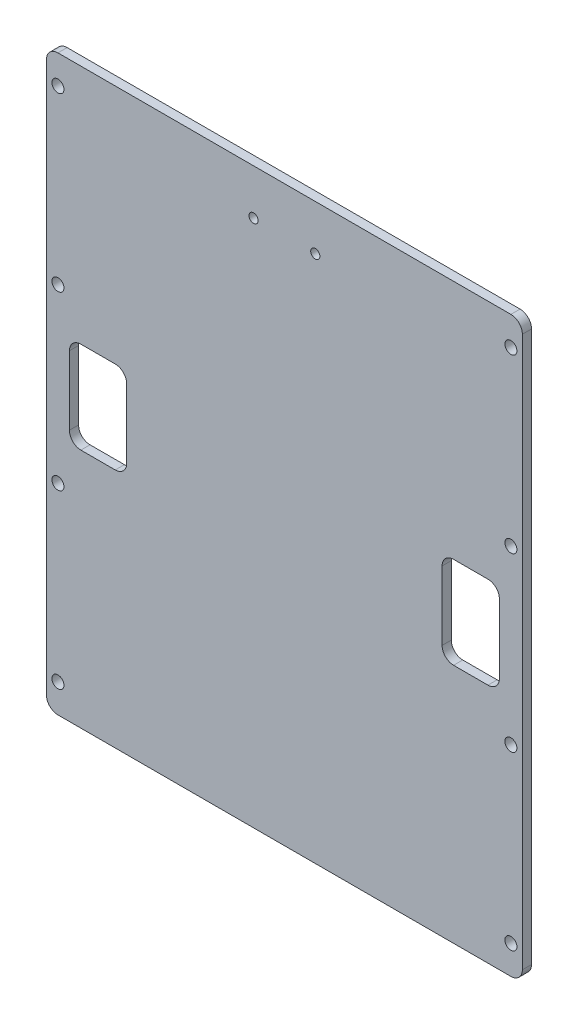
ISO-10303-21;
HEADER;
FILE_DESCRIPTION(('STEP AP214'),'2;1');
FILE_NAME('part.step','',(''),(''),'','','');
FILE_SCHEMA(('AUTOMOTIVE_DESIGN { 1 0 10303 214 1 1 1 1 }'));
ENDSEC;
DATA;
#1=APPLICATION_CONTEXT('core data for automotive mechanical design processes');
#2=APPLICATION_PROTOCOL_DEFINITION('international standard','automotive_design',2000,#1);
#3=PRODUCT_CONTEXT('',#1,'mechanical');
#4=PRODUCT('Part','Part','',(#3));
#5=PRODUCT_RELATED_PRODUCT_CATEGORY('part','',(#4));
#6=PRODUCT_DEFINITION_FORMATION('','',#4);
#7=PRODUCT_DEFINITION_CONTEXT('part definition',#1,'design');
#8=PRODUCT_DEFINITION('design','',#6,#7);
#9=PRODUCT_DEFINITION_SHAPE('','',#8);
#10=(LENGTH_UNIT() NAMED_UNIT(*) SI_UNIT(.MILLI.,.METRE.));
#11=(NAMED_UNIT(*) PLANE_ANGLE_UNIT() SI_UNIT($,.RADIAN.));
#12=(NAMED_UNIT(*) SI_UNIT($,.STERADIAN.) SOLID_ANGLE_UNIT());
#13=UNCERTAINTY_MEASURE_WITH_UNIT(LENGTH_MEASURE(1.E-05),#10,'distance_accuracy_value','');
#14=(GEOMETRIC_REPRESENTATION_CONTEXT(3) GLOBAL_UNCERTAINTY_ASSIGNED_CONTEXT((#13)) GLOBAL_UNIT_ASSIGNED_CONTEXT((#10,
#11,#12)) REPRESENTATION_CONTEXT('',''));
#15=CARTESIAN_POINT('',(0.,0.,0.));
#16=DIRECTION('',(0.,0.,1.));
#17=DIRECTION('',(1.,0.,0.));
#18=AXIS2_PLACEMENT_3D('',#15,#16,#17);
#19=CARTESIAN_POINT('',(-39.5,-48.,1.6));
#20=DIRECTION('',(0.,0.,-1.));
#21=DIRECTION('',(-1.,0.,0.));
#22=AXIS2_PLACEMENT_3D('',#19,#20,#21);
#23=CYLINDRICAL_SURFACE('',#22,2.);
#24=CARTESIAN_POINT('',(-39.5,-48.,0.));
#25=DIRECTION('',(0.,0.,1.));
#26=DIRECTION('',(-1.,0.,0.));
#27=AXIS2_PLACEMENT_3D('',#24,#25,#26);
#28=CIRCLE('',#27,2.);
#29=CARTESIAN_POINT('',(-41.5,-48.,0.));
#30=VERTEX_POINT('',#29);
#31=CARTESIAN_POINT('',(-39.5,-50.,0.));
#32=VERTEX_POINT('',#31);
#33=EDGE_CURVE('E340',#30,#32,#28,.T.);
#34=ORIENTED_EDGE('',*,*,#33,.T.);
#35=DIRECTION('',(0.,0.,-1.));
#36=VECTOR('',#35,1.);
#37=CARTESIAN_POINT('',(-39.5,-50.,1.6));
#38=LINE('',#37,#36);
#39=CARTESIAN_POINT('',(-39.5,-50.,1.6));
#40=VERTEX_POINT('',#39);
#41=EDGE_CURVE('E11',#40,#32,#38,.T.);
#42=ORIENTED_EDGE('',*,*,#41,.F.);
#43=CARTESIAN_POINT('',(-39.5,-48.,1.6));
#44=DIRECTION('',(0.,0.,1.));
#45=DIRECTION('',(-1.,0.,0.));
#46=AXIS2_PLACEMENT_3D('',#43,#44,#45);
#47=CIRCLE('',#46,2.);
#48=CARTESIAN_POINT('',(-41.5,-48.,1.6));
#49=VERTEX_POINT('',#48);
#50=EDGE_CURVE('E343',#49,#40,#47,.T.);
#51=ORIENTED_EDGE('',*,*,#50,.F.);
#52=DIRECTION('',(0.,0.,-1.));
#53=VECTOR('',#52,1.);
#54=CARTESIAN_POINT('',(-41.5,-48.,1.6));
#55=LINE('',#54,#53);
#56=EDGE_CURVE('E361',#49,#30,#55,.T.);
#57=ORIENTED_EDGE('',*,*,#56,.T.);
#58=EDGE_LOOP('',(#34,#42,#51,#57));
#59=FACE_BOUND('',#58,.T.);
#60=ADVANCED_FACE('F35',(#59),#23,.T.);
#61=CARTESIAN_POINT('',(-39.5,-50.,1.6));
#62=DIRECTION('',(0.,1.,0.));
#63=DIRECTION('',(0.,0.,1.));
#64=AXIS2_PLACEMENT_3D('',#61,#62,#63);
#65=PLANE('',#64);
#66=DIRECTION('',(1.,0.,0.));
#67=VECTOR('',#66,1.);
#68=CARTESIAN_POINT('',(-39.5,-50.,0.));
#69=LINE('',#68,#67);
#70=CARTESIAN_POINT('',(39.5,-50.,0.));
#71=VERTEX_POINT('',#70);
#72=EDGE_CURVE('E364',#32,#71,#69,.T.);
#73=ORIENTED_EDGE('',*,*,#72,.T.);
#74=DIRECTION('',(0.,0.,-1.));
#75=VECTOR('',#74,1.);
#76=CARTESIAN_POINT('',(39.5,-50.,1.6));
#77=LINE('',#76,#75);
#78=CARTESIAN_POINT('',(39.5,-50.,1.6));
#79=VERTEX_POINT('',#78);
#80=EDGE_CURVE('E42',#79,#71,#77,.T.);
#81=ORIENTED_EDGE('',*,*,#80,.F.);
#82=DIRECTION('',(1.,0.,0.));
#83=VECTOR('',#82,1.);
#84=CARTESIAN_POINT('',(-39.5,-50.,1.6));
#85=LINE('',#84,#83);
#86=EDGE_CURVE('E346',#40,#79,#85,.T.);
#87=ORIENTED_EDGE('',*,*,#86,.F.);
#88=ORIENTED_EDGE('',*,*,#41,.T.);
#89=EDGE_LOOP('',(#73,#81,#87,#88));
#90=FACE_BOUND('',#89,.T.);
#91=ADVANCED_FACE('F420',(#90),#65,.F.);
#92=CARTESIAN_POINT('',(39.5,-48.,1.6));
#93=DIRECTION('',(0.,0.,-1.));
#94=DIRECTION('',(-1.,0.,0.));
#95=AXIS2_PLACEMENT_3D('',#92,#93,#94);
#96=CYLINDRICAL_SURFACE('',#95,2.);
#97=CARTESIAN_POINT('',(39.5,-48.,0.));
#98=DIRECTION('',(0.,0.,1.));
#99=DIRECTION('',(1.,0.,0.));
#100=AXIS2_PLACEMENT_3D('',#97,#98,#99);
#101=CIRCLE('',#100,2.);
#102=CARTESIAN_POINT('',(41.5,-48.,0.));
#103=VERTEX_POINT('',#102);
#104=EDGE_CURVE('E366',#71,#103,#101,.T.);
#105=ORIENTED_EDGE('',*,*,#104,.T.);
#106=DIRECTION('',(0.,0.,-1.));
#107=VECTOR('',#106,1.);
#108=CARTESIAN_POINT('',(41.5,-48.,1.6));
#109=LINE('',#108,#107);
#110=CARTESIAN_POINT('',(41.5,-48.,1.6));
#111=VERTEX_POINT('',#110);
#112=EDGE_CURVE('E391',#111,#103,#109,.T.);
#113=ORIENTED_EDGE('',*,*,#112,.F.);
#114=CARTESIAN_POINT('',(39.5,-48.,1.6));
#115=DIRECTION('',(0.,0.,1.));
#116=DIRECTION('',(1.,0.,0.));
#117=AXIS2_PLACEMENT_3D('',#114,#115,#116);
#118=CIRCLE('',#117,2.);
#119=EDGE_CURVE('E349',#79,#111,#118,.T.);
#120=ORIENTED_EDGE('',*,*,#119,.F.);
#121=ORIENTED_EDGE('',*,*,#80,.T.);
#122=EDGE_LOOP('',(#105,#113,#120,#121));
#123=FACE_BOUND('',#122,.T.);
#124=ADVANCED_FACE('F398',(#123),#96,.T.);
#125=CARTESIAN_POINT('',(41.5,-48.,1.6));
#126=DIRECTION('',(-1.,0.,0.));
#127=DIRECTION('',(0.,0.,1.));
#128=AXIS2_PLACEMENT_3D('',#125,#126,#127);
#129=PLANE('',#128);
#130=DIRECTION('',(0.,1.,0.));
#131=VECTOR('',#130,1.);
#132=CARTESIAN_POINT('',(41.5,-48.,0.));
#133=LINE('',#132,#131);
#134=CARTESIAN_POINT('',(41.5,48.,0.));
#135=VERTEX_POINT('',#134);
#136=EDGE_CURVE('E368',#103,#135,#133,.T.);
#137=ORIENTED_EDGE('',*,*,#136,.T.);
#138=DIRECTION('',(0.,0.,-1.));
#139=VECTOR('',#138,1.);
#140=CARTESIAN_POINT('',(41.5,48.,1.6));
#141=LINE('',#140,#139);
#142=CARTESIAN_POINT('',(41.5,48.,1.6));
#143=VERTEX_POINT('',#142);
#144=EDGE_CURVE('E388',#143,#135,#141,.T.);
#145=ORIENTED_EDGE('',*,*,#144,.F.);
#146=DIRECTION('',(0.,1.,0.));
#147=VECTOR('',#146,1.);
#148=CARTESIAN_POINT('',(41.5,-48.,1.6));
#149=LINE('',#148,#147);
#150=EDGE_CURVE('E351',#111,#143,#149,.T.);
#151=ORIENTED_EDGE('',*,*,#150,.F.);
#152=ORIENTED_EDGE('',*,*,#112,.T.);
#153=EDGE_LOOP('',(#137,#145,#151,#152));
#154=FACE_BOUND('',#153,.T.);
#155=ADVANCED_FACE('F408',(#154),#129,.F.);
#156=CARTESIAN_POINT('',(39.5,48.,1.6));
#157=DIRECTION('',(0.,0.,-1.));
#158=DIRECTION('',(-1.,0.,0.));
#159=AXIS2_PLACEMENT_3D('',#156,#157,#158);
#160=CYLINDRICAL_SURFACE('',#159,2.);
#161=CARTESIAN_POINT('',(39.5,48.,0.));
#162=DIRECTION('',(0.,0.,1.));
#163=DIRECTION('',(-1.,0.,0.));
#164=AXIS2_PLACEMENT_3D('',#161,#162,#163);
#165=CIRCLE('',#164,2.);
#166=CARTESIAN_POINT('',(39.5,50.,0.));
#167=VERTEX_POINT('',#166);
#168=EDGE_CURVE('E370',#135,#167,#165,.T.);
#169=ORIENTED_EDGE('',*,*,#168,.T.);
#170=DIRECTION('',(0.,0.,-1.));
#171=VECTOR('',#170,1.);
#172=CARTESIAN_POINT('',(39.5,50.,1.6));
#173=LINE('',#172,#171);
#174=CARTESIAN_POINT('',(39.5,50.,1.6));
#175=VERTEX_POINT('',#174);
#176=EDGE_CURVE('E385',#175,#167,#173,.T.);
#177=ORIENTED_EDGE('',*,*,#176,.F.);
#178=CARTESIAN_POINT('',(39.5,48.,1.6));
#179=DIRECTION('',(0.,0.,1.));
#180=DIRECTION('',(-1.,0.,0.));
#181=AXIS2_PLACEMENT_3D('',#178,#179,#180);
#182=CIRCLE('',#181,2.);
#183=EDGE_CURVE('E353',#143,#175,#182,.T.);
#184=ORIENTED_EDGE('',*,*,#183,.F.);
#185=ORIENTED_EDGE('',*,*,#144,.T.);
#186=EDGE_LOOP('',(#169,#177,#184,#185));
#187=FACE_BOUND('',#186,.T.);
#188=ADVANCED_FACE('F412',(#187),#160,.T.);
#189=CARTESIAN_POINT('',(-39.5,50.,1.6));
#190=DIRECTION('',(0.,-1.,0.));
#191=DIRECTION('',(0.,0.,-1.));
#192=AXIS2_PLACEMENT_3D('',#189,#190,#191);
#193=PLANE('',#192);
#194=DIRECTION('',(-1.,0.,0.));
#195=VECTOR('',#194,1.);
#196=CARTESIAN_POINT('',(-39.5,50.,0.));
#197=LINE('',#196,#195);
#198=CARTESIAN_POINT('',(-39.5,50.,0.));
#199=VERTEX_POINT('',#198);
#200=EDGE_CURVE('E372',#167,#199,#197,.T.);
#201=ORIENTED_EDGE('',*,*,#200,.T.);
#202=DIRECTION('',(0.,0.,-1.));
#203=VECTOR('',#202,1.);
#204=CARTESIAN_POINT('',(-39.5,50.,1.6));
#205=LINE('',#204,#203);
#206=CARTESIAN_POINT('',(-39.5,50.,1.6));
#207=VERTEX_POINT('',#206);
#208=EDGE_CURVE('E382',#207,#199,#205,.T.);
#209=ORIENTED_EDGE('',*,*,#208,.F.);
#210=DIRECTION('',(-1.,0.,0.));
#211=VECTOR('',#210,1.);
#212=CARTESIAN_POINT('',(-39.5,50.,1.6));
#213=LINE('',#212,#211);
#214=EDGE_CURVE('E355',#175,#207,#213,.T.);
#215=ORIENTED_EDGE('',*,*,#214,.F.);
#216=ORIENTED_EDGE('',*,*,#176,.T.);
#217=EDGE_LOOP('',(#201,#209,#215,#216));
#218=FACE_BOUND('',#217,.T.);
#219=ADVANCED_FACE('F433',(#218),#193,.F.);
#220=CARTESIAN_POINT('',(-39.5,48.,1.6));
#221=DIRECTION('',(0.,0.,-1.));
#222=DIRECTION('',(-1.,0.,0.));
#223=AXIS2_PLACEMENT_3D('',#220,#221,#222);
#224=CYLINDRICAL_SURFACE('',#223,2.);
#225=CARTESIAN_POINT('',(-39.5,48.,0.));
#226=DIRECTION('',(0.,0.,1.));
#227=DIRECTION('',(-1.,0.,0.));
#228=AXIS2_PLACEMENT_3D('',#225,#226,#227);
#229=CIRCLE('',#228,2.);
#230=CARTESIAN_POINT('',(-41.5,48.,0.));
#231=VERTEX_POINT('',#230);
#232=EDGE_CURVE('E374',#199,#231,#229,.T.);
#233=ORIENTED_EDGE('',*,*,#232,.T.);
#234=DIRECTION('',(0.,0.,-1.));
#235=VECTOR('',#234,1.);
#236=CARTESIAN_POINT('',(-41.5,48.,1.6));
#237=LINE('',#236,#235);
#238=CARTESIAN_POINT('',(-41.5,48.,1.6));
#239=VERTEX_POINT('',#238);
#240=EDGE_CURVE('E379',#239,#231,#237,.T.);
#241=ORIENTED_EDGE('',*,*,#240,.F.);
#242=CARTESIAN_POINT('',(-39.5,48.,1.6));
#243=DIRECTION('',(0.,0.,1.));
#244=DIRECTION('',(-1.,0.,0.));
#245=AXIS2_PLACEMENT_3D('',#242,#243,#244);
#246=CIRCLE('',#245,2.);
#247=EDGE_CURVE('E357',#207,#239,#246,.T.);
#248=ORIENTED_EDGE('',*,*,#247,.F.);
#249=ORIENTED_EDGE('',*,*,#208,.T.);
#250=EDGE_LOOP('',(#233,#241,#248,#249));
#251=FACE_BOUND('',#250,.T.);
#252=ADVANCED_FACE('F431',(#251),#224,.T.);
#253=CARTESIAN_POINT('',(-41.5,-48.,1.6));
#254=DIRECTION('',(1.,0.,0.));
#255=DIRECTION('',(0.,0.,-1.));
#256=AXIS2_PLACEMENT_3D('',#253,#254,#255);
#257=PLANE('',#256);
#258=DIRECTION('',(0.,-1.,0.));
#259=VECTOR('',#258,1.);
#260=CARTESIAN_POINT('',(-41.5,-48.,0.));
#261=LINE('',#260,#259);
#262=EDGE_CURVE('E347',#231,#30,#261,.T.);
#263=ORIENTED_EDGE('',*,*,#262,.T.);
#264=ORIENTED_EDGE('',*,*,#56,.F.);
#265=DIRECTION('',(0.,-1.,0.));
#266=VECTOR('',#265,1.);
#267=CARTESIAN_POINT('',(-41.5,-48.,1.6));
#268=LINE('',#267,#266);
#269=EDGE_CURVE('E359',#239,#49,#268,.T.);
#270=ORIENTED_EDGE('',*,*,#269,.F.);
#271=ORIENTED_EDGE('',*,*,#240,.T.);
#272=EDGE_LOOP('',(#263,#264,#270,#271));
#273=FACE_BOUND('',#272,.T.);
#274=ADVANCED_FACE('F426',(#273),#257,.F.);
#275=CARTESIAN_POINT('',(-39.5,-48.,1.6));
#276=DIRECTION('',(0.,0.,-1.));
#277=DIRECTION('',(-1.,0.,0.));
#278=AXIS2_PLACEMENT_3D('',#275,#276,#277);
#279=PLANE('',#278);
#280=CARTESIAN_POINT('',(39.5,45.,1.6));
#281=DIRECTION('',(0.,0.,-1.));
#282=DIRECTION('',(-1.,0.,0.));
#283=AXIS2_PLACEMENT_3D('',#280,#281,#282);
#284=CIRCLE('',#283,1.05);
#285=CARTESIAN_POINT('',(38.45,45.,1.6));
#286=VERTEX_POINT('',#285);
#287=EDGE_CURVE('E760',#286,#286,#284,.T.);
#288=ORIENTED_EDGE('',*,*,#287,.T.);
#289=EDGE_LOOP('',(#288));
#290=FACE_BOUND('',#289,.T.);
#291=CARTESIAN_POINT('',(39.5,-15.,1.6));
#292=DIRECTION('',(0.,0.,-1.));
#293=DIRECTION('',(-1.,0.,0.));
#294=AXIS2_PLACEMENT_3D('',#291,#292,#293);
#295=CIRCLE('',#294,1.05);
#296=CARTESIAN_POINT('',(38.45,-15.,1.6));
#297=VERTEX_POINT('',#296);
#298=EDGE_CURVE('E770',#297,#297,#295,.T.);
#299=ORIENTED_EDGE('',*,*,#298,.T.);
#300=EDGE_LOOP('',(#299));
#301=FACE_BOUND('',#300,.T.);
#302=CARTESIAN_POINT('',(39.5,-45.,1.6));
#303=DIRECTION('',(0.,0.,-1.));
#304=DIRECTION('',(-1.,0.,0.));
#305=AXIS2_PLACEMENT_3D('',#302,#303,#304);
#306=CIRCLE('',#305,1.05);
#307=CARTESIAN_POINT('',(38.45,-45.,1.6));
#308=VERTEX_POINT('',#307);
#309=EDGE_CURVE('E776',#308,#308,#306,.T.);
#310=ORIENTED_EDGE('',*,*,#309,.T.);
#311=EDGE_LOOP('',(#310));
#312=FACE_BOUND('',#311,.T.);
#313=CARTESIAN_POINT('',(39.5,15.,1.6));
#314=DIRECTION('',(0.,0.,-1.));
#315=DIRECTION('',(-1.,0.,0.));
#316=AXIS2_PLACEMENT_3D('',#313,#314,#315);
#317=CIRCLE('',#316,1.05);
#318=CARTESIAN_POINT('',(38.45,15.,1.6));
#319=VERTEX_POINT('',#318);
#320=EDGE_CURVE('E782',#319,#319,#317,.T.);
#321=ORIENTED_EDGE('',*,*,#320,.T.);
#322=EDGE_LOOP('',(#321));
#323=FACE_BOUND('',#322,.T.);
#324=CARTESIAN_POINT('',(-39.5,45.,1.6));
#325=DIRECTION('',(0.,0.,-1.));
#326=DIRECTION('',(-1.,0.,0.));
#327=AXIS2_PLACEMENT_3D('',#324,#325,#326);
#328=CIRCLE('',#327,1.05);
#329=CARTESIAN_POINT('',(-40.55,45.,1.6));
#330=VERTEX_POINT('',#329);
#331=EDGE_CURVE('E788',#330,#330,#328,.T.);
#332=ORIENTED_EDGE('',*,*,#331,.T.);
#333=EDGE_LOOP('',(#332));
#334=FACE_BOUND('',#333,.T.);
#335=CARTESIAN_POINT('',(-39.5,-15.,1.6));
#336=DIRECTION('',(0.,0.,-1.));
#337=DIRECTION('',(-1.,0.,0.));
#338=AXIS2_PLACEMENT_3D('',#335,#336,#337);
#339=CIRCLE('',#338,1.05);
#340=CARTESIAN_POINT('',(-40.55,-15.,1.6));
#341=VERTEX_POINT('',#340);
#342=EDGE_CURVE('E794',#341,#341,#339,.T.);
#343=ORIENTED_EDGE('',*,*,#342,.T.);
#344=EDGE_LOOP('',(#343));
#345=FACE_BOUND('',#344,.T.);
#346=CARTESIAN_POINT('',(-39.5,-45.,1.6));
#347=DIRECTION('',(0.,0.,-1.));
#348=DIRECTION('',(-1.,0.,0.));
#349=AXIS2_PLACEMENT_3D('',#346,#347,#348);
#350=CIRCLE('',#349,1.05);
#351=CARTESIAN_POINT('',(-40.55,-45.,1.6));
#352=VERTEX_POINT('',#351);
#353=EDGE_CURVE('E800',#352,#352,#350,.T.);
#354=ORIENTED_EDGE('',*,*,#353,.T.);
#355=EDGE_LOOP('',(#354));
#356=FACE_BOUND('',#355,.T.);
#357=CARTESIAN_POINT('',(-39.5,15.,1.6));
#358=DIRECTION('',(0.,0.,-1.));
#359=DIRECTION('',(-1.,0.,0.));
#360=AXIS2_PLACEMENT_3D('',#357,#358,#359);
#361=CIRCLE('',#360,1.05);
#362=CARTESIAN_POINT('',(-40.55,15.,1.6));
#363=VERTEX_POINT('',#362);
#364=EDGE_CURVE('E220',#363,#363,#361,.T.);
#365=ORIENTED_EDGE('',*,*,#364,.T.);
#366=EDGE_LOOP('',(#365));
#367=FACE_BOUND('',#366,.T.);
#368=DIRECTION('',(0.,1.,0.));
#369=VECTOR('',#368,1.);
#370=CARTESIAN_POINT('',(-27.5,-6.,1.6));
#371=LINE('',#370,#369);
#372=CARTESIAN_POINT('',(-27.5,-6.,1.6));
#373=VERTEX_POINT('',#372);
#374=CARTESIAN_POINT('',(-27.5,6.,1.6));
#375=VERTEX_POINT('',#374);
#376=EDGE_CURVE('E237',#373,#375,#371,.T.);
#377=ORIENTED_EDGE('',*,*,#376,.F.);
#378=CARTESIAN_POINT('',(-29.5,-6.,1.6));
#379=DIRECTION('',(0.,0.,1.));
#380=DIRECTION('',(1.,0.,0.));
#381=AXIS2_PLACEMENT_3D('',#378,#379,#380);
#382=CIRCLE('',#381,2.);
#383=CARTESIAN_POINT('',(-29.5,-8.,1.6));
#384=VERTEX_POINT('',#383);
#385=EDGE_CURVE('E49',#384,#373,#382,.T.);
#386=ORIENTED_EDGE('',*,*,#385,.F.);
#387=DIRECTION('',(1.,0.,0.));
#388=VECTOR('',#387,1.);
#389=CARTESIAN_POINT('',(-29.5,-8.,1.6));
#390=LINE('',#389,#388);
#391=CARTESIAN_POINT('',(-35.5,-8.,1.6));
#392=VERTEX_POINT('',#391);
#393=EDGE_CURVE('E214',#392,#384,#390,.T.);
#394=ORIENTED_EDGE('',*,*,#393,.F.);
#395=CARTESIAN_POINT('',(-35.5,-6.,1.6));
#396=DIRECTION('',(0.,0.,1.));
#397=DIRECTION('',(-1.,0.,0.));
#398=AXIS2_PLACEMENT_3D('',#395,#396,#397);
#399=CIRCLE('',#398,2.);
#400=CARTESIAN_POINT('',(-37.5,-6.,1.6));
#401=VERTEX_POINT('',#400);
#402=EDGE_CURVE('E217',#401,#392,#399,.T.);
#403=ORIENTED_EDGE('',*,*,#402,.F.);
#404=DIRECTION('',(0.,-1.,0.));
#405=VECTOR('',#404,1.);
#406=CARTESIAN_POINT('',(-37.5,-6.,1.6));
#407=LINE('',#406,#405);
#408=CARTESIAN_POINT('',(-37.5,6.,1.6));
#409=VERTEX_POINT('',#408);
#410=EDGE_CURVE('E248',#409,#401,#407,.T.);
#411=ORIENTED_EDGE('',*,*,#410,.F.);
#412=CARTESIAN_POINT('',(-35.5,6.,1.6));
#413=DIRECTION('',(0.,0.,1.));
#414=DIRECTION('',(1.,0.,0.));
#415=AXIS2_PLACEMENT_3D('',#412,#413,#414);
#416=CIRCLE('',#415,2.);
#417=CARTESIAN_POINT('',(-35.5,8.,1.6));
#418=VERTEX_POINT('',#417);
#419=EDGE_CURVE('E245',#418,#409,#416,.T.);
#420=ORIENTED_EDGE('',*,*,#419,.F.);
#421=DIRECTION('',(-1.,0.,0.));
#422=VECTOR('',#421,1.);
#423=CARTESIAN_POINT('',(-29.5,8.,1.6));
#424=LINE('',#423,#422);
#425=CARTESIAN_POINT('',(-29.5,8.,1.6));
#426=VERTEX_POINT('',#425);
#427=EDGE_CURVE('E242',#426,#418,#424,.T.);
#428=ORIENTED_EDGE('',*,*,#427,.F.);
#429=CARTESIAN_POINT('',(-29.5,6.,1.6));
#430=DIRECTION('',(0.,0.,1.));
#431=DIRECTION('',(1.,0.,0.));
#432=AXIS2_PLACEMENT_3D('',#429,#430,#431);
#433=CIRCLE('',#432,2.);
#434=EDGE_CURVE('E239',#375,#426,#433,.T.);
#435=ORIENTED_EDGE('',*,*,#434,.F.);
#436=EDGE_LOOP('',(#377,#386,#394,#403,#411,#420,#428,#435));
#437=FACE_BOUND('',#436,.T.);
#438=DIRECTION('',(0.,-1.,0.));
#439=VECTOR('',#438,1.);
#440=CARTESIAN_POINT('',(27.5,-6.,1.6));
#441=LINE('',#440,#439);
#442=CARTESIAN_POINT('',(27.5,6.,1.6));
#443=VERTEX_POINT('',#442);
#444=CARTESIAN_POINT('',(27.5,-6.,1.6));
#445=VERTEX_POINT('',#444);
#446=EDGE_CURVE('E294',#443,#445,#441,.T.);
#447=ORIENTED_EDGE('',*,*,#446,.F.);
#448=CARTESIAN_POINT('',(29.5,6.,1.6));
#449=DIRECTION('',(0.,0.,1.));
#450=DIRECTION('',(-1.,0.,0.));
#451=AXIS2_PLACEMENT_3D('',#448,#449,#450);
#452=CIRCLE('',#451,2.);
#453=CARTESIAN_POINT('',(29.5,8.,1.6));
#454=VERTEX_POINT('',#453);
#455=EDGE_CURVE('E255',#454,#443,#452,.T.);
#456=ORIENTED_EDGE('',*,*,#455,.F.);
#457=DIRECTION('',(-1.,0.,0.));
#458=VECTOR('',#457,1.);
#459=CARTESIAN_POINT('',(29.5,8.,1.6));
#460=LINE('',#459,#458);
#461=CARTESIAN_POINT('',(35.5,8.,1.6));
#462=VERTEX_POINT('',#461);
#463=EDGE_CURVE('E271',#462,#454,#460,.T.);
#464=ORIENTED_EDGE('',*,*,#463,.F.);
#465=CARTESIAN_POINT('',(35.5,6.,1.6));
#466=DIRECTION('',(0.,0.,1.));
#467=DIRECTION('',(-1.,0.,0.));
#468=AXIS2_PLACEMENT_3D('',#465,#466,#467);
#469=CIRCLE('',#468,2.);
#470=CARTESIAN_POINT('',(37.5,6.,1.6));
#471=VERTEX_POINT('',#470);
#472=EDGE_CURVE('E309',#471,#462,#469,.T.);
#473=ORIENTED_EDGE('',*,*,#472,.F.);
#474=DIRECTION('',(0.,1.,0.));
#475=VECTOR('',#474,1.);
#476=CARTESIAN_POINT('',(37.5,-6.,1.6));
#477=LINE('',#476,#475);
#478=CARTESIAN_POINT('',(37.5,-6.,1.6));
#479=VERTEX_POINT('',#478);
#480=EDGE_CURVE('E306',#479,#471,#477,.T.);
#481=ORIENTED_EDGE('',*,*,#480,.F.);
#482=CARTESIAN_POINT('',(35.5,-6.,1.6));
#483=DIRECTION('',(0.,0.,1.));
#484=DIRECTION('',(1.,0.,0.));
#485=AXIS2_PLACEMENT_3D('',#482,#483,#484);
#486=CIRCLE('',#485,2.);
#487=CARTESIAN_POINT('',(35.5,-8.,1.6));
#488=VERTEX_POINT('',#487);
#489=EDGE_CURVE('E303',#488,#479,#486,.T.);
#490=ORIENTED_EDGE('',*,*,#489,.F.);
#491=DIRECTION('',(1.,0.,0.));
#492=VECTOR('',#491,1.);
#493=CARTESIAN_POINT('',(29.5,-8.,1.6));
#494=LINE('',#493,#492);
#495=CARTESIAN_POINT('',(29.5,-8.,1.6));
#496=VERTEX_POINT('',#495);
#497=EDGE_CURVE('E300',#496,#488,#494,.T.);
#498=ORIENTED_EDGE('',*,*,#497,.F.);
#499=CARTESIAN_POINT('',(29.5,-6.,1.6));
#500=DIRECTION('',(0.,0.,1.));
#501=DIRECTION('',(-1.,0.,0.));
#502=AXIS2_PLACEMENT_3D('',#499,#500,#501);
#503=CIRCLE('',#502,2.);
#504=EDGE_CURVE('E297',#445,#496,#503,.T.);
#505=ORIENTED_EDGE('',*,*,#504,.F.);
#506=EDGE_LOOP('',(#447,#456,#464,#473,#481,#490,#498,#505));
#507=FACE_BOUND('',#506,.T.);
#508=CARTESIAN_POINT('',(5.385,42.1,1.6));
#509=DIRECTION('',(0.,0.,1.));
#510=DIRECTION('',(1.,0.,0.));
#511=AXIS2_PLACEMENT_3D('',#508,#509,#510);
#512=CIRCLE('',#511,0.800000000000002);
#513=CARTESIAN_POINT('',(6.185,42.1,1.6));
#514=VERTEX_POINT('',#513);
#515=EDGE_CURVE('E316',#514,#514,#512,.T.);
#516=ORIENTED_EDGE('',*,*,#515,.F.);
#517=EDGE_LOOP('',(#516));
#518=FACE_BOUND('',#517,.T.);
#519=CARTESIAN_POINT('',(-5.385,42.1,1.6));
#520=DIRECTION('',(0.,0.,1.));
#521=DIRECTION('',(1.,0.,0.));
#522=AXIS2_PLACEMENT_3D('',#519,#520,#521);
#523=CIRCLE('',#522,0.800000000000001);
#524=CARTESIAN_POINT('',(-4.585,42.1,1.6));
#525=VERTEX_POINT('',#524);
#526=EDGE_CURVE('E334',#525,#525,#523,.T.);
#527=ORIENTED_EDGE('',*,*,#526,.F.);
#528=EDGE_LOOP('',(#527));
#529=FACE_BOUND('',#528,.T.);
#530=ORIENTED_EDGE('',*,*,#50,.T.);
#531=ORIENTED_EDGE('',*,*,#86,.T.);
#532=ORIENTED_EDGE('',*,*,#119,.T.);
#533=ORIENTED_EDGE('',*,*,#150,.T.);
#534=ORIENTED_EDGE('',*,*,#183,.T.);
#535=ORIENTED_EDGE('',*,*,#214,.T.);
#536=ORIENTED_EDGE('',*,*,#247,.T.);
#537=ORIENTED_EDGE('',*,*,#269,.T.);
#538=EDGE_LOOP('',(#530,#531,#532,#533,#534,#535,#536,#537));
#539=FACE_BOUND('',#538,.T.);
#540=ADVANCED_FACE('F416',(#290,#301,#312,#323,#334,#345,#356,#367,#437,#507,#518,#529,#539),
#279,.F.);
#541=CARTESIAN_POINT('',(-39.5,-48.,0.));
#542=DIRECTION('',(0.,0.,-1.));
#543=DIRECTION('',(-1.,0.,0.));
#544=AXIS2_PLACEMENT_3D('',#541,#542,#543);
#545=PLANE('',#544);
#546=CARTESIAN_POINT('',(39.5,45.,0.));
#547=DIRECTION('',(0.,0.,-1.));
#548=DIRECTION('',(-1.,0.,0.));
#549=AXIS2_PLACEMENT_3D('',#546,#547,#548);
#550=CIRCLE('',#549,1.05);
#551=CARTESIAN_POINT('',(38.45,45.,0.));
#552=VERTEX_POINT('',#551);
#553=EDGE_CURVE('E763',#552,#552,#550,.T.);
#554=ORIENTED_EDGE('',*,*,#553,.F.);
#555=EDGE_LOOP('',(#554));
#556=FACE_BOUND('',#555,.T.);
#557=CARTESIAN_POINT('',(39.5,-15.,0.));
#558=DIRECTION('',(0.,0.,-1.));
#559=DIRECTION('',(-1.,0.,0.));
#560=AXIS2_PLACEMENT_3D('',#557,#558,#559);
#561=CIRCLE('',#560,1.05);
#562=CARTESIAN_POINT('',(38.45,-15.,0.));
#563=VERTEX_POINT('',#562);
#564=EDGE_CURVE('E765',#563,#563,#561,.T.);
#565=ORIENTED_EDGE('',*,*,#564,.F.);
#566=EDGE_LOOP('',(#565));
#567=FACE_BOUND('',#566,.T.);
#568=CARTESIAN_POINT('',(39.5,-45.,0.));
#569=DIRECTION('',(0.,0.,-1.));
#570=DIRECTION('',(-1.,0.,0.));
#571=AXIS2_PLACEMENT_3D('',#568,#569,#570);
#572=CIRCLE('',#571,1.05);
#573=CARTESIAN_POINT('',(38.45,-45.,0.));
#574=VERTEX_POINT('',#573);
#575=EDGE_CURVE('E773',#574,#574,#572,.T.);
#576=ORIENTED_EDGE('',*,*,#575,.F.);
#577=EDGE_LOOP('',(#576));
#578=FACE_BOUND('',#577,.T.);
#579=CARTESIAN_POINT('',(39.5,15.,0.));
#580=DIRECTION('',(0.,0.,-1.));
#581=DIRECTION('',(-1.,0.,0.));
#582=AXIS2_PLACEMENT_3D('',#579,#580,#581);
#583=CIRCLE('',#582,1.05);
#584=CARTESIAN_POINT('',(38.45,15.,0.));
#585=VERTEX_POINT('',#584);
#586=EDGE_CURVE('E779',#585,#585,#583,.T.);
#587=ORIENTED_EDGE('',*,*,#586,.F.);
#588=EDGE_LOOP('',(#587));
#589=FACE_BOUND('',#588,.T.);
#590=CARTESIAN_POINT('',(-39.5,45.,0.));
#591=DIRECTION('',(0.,0.,-1.));
#592=DIRECTION('',(-1.,0.,0.));
#593=AXIS2_PLACEMENT_3D('',#590,#591,#592);
#594=CIRCLE('',#593,1.05);
#595=CARTESIAN_POINT('',(-40.55,45.,0.));
#596=VERTEX_POINT('',#595);
#597=EDGE_CURVE('E785',#596,#596,#594,.T.);
#598=ORIENTED_EDGE('',*,*,#597,.F.);
#599=EDGE_LOOP('',(#598));
#600=FACE_BOUND('',#599,.T.);
#601=CARTESIAN_POINT('',(-39.5,-15.,0.));
#602=DIRECTION('',(0.,0.,-1.));
#603=DIRECTION('',(-1.,0.,0.));
#604=AXIS2_PLACEMENT_3D('',#601,#602,#603);
#605=CIRCLE('',#604,1.05);
#606=CARTESIAN_POINT('',(-40.55,-15.,0.));
#607=VERTEX_POINT('',#606);
#608=EDGE_CURVE('E791',#607,#607,#605,.T.);
#609=ORIENTED_EDGE('',*,*,#608,.F.);
#610=EDGE_LOOP('',(#609));
#611=FACE_BOUND('',#610,.T.);
#612=CARTESIAN_POINT('',(-39.5,-45.,0.));
#613=DIRECTION('',(0.,0.,-1.));
#614=DIRECTION('',(-1.,0.,0.));
#615=AXIS2_PLACEMENT_3D('',#612,#613,#614);
#616=CIRCLE('',#615,1.05);
#617=CARTESIAN_POINT('',(-40.55,-45.,0.));
#618=VERTEX_POINT('',#617);
#619=EDGE_CURVE('E797',#618,#618,#616,.T.);
#620=ORIENTED_EDGE('',*,*,#619,.F.);
#621=EDGE_LOOP('',(#620));
#622=FACE_BOUND('',#621,.T.);
#623=CARTESIAN_POINT('',(-39.5,15.,0.));
#624=DIRECTION('',(0.,0.,-1.));
#625=DIRECTION('',(-1.,0.,0.));
#626=AXIS2_PLACEMENT_3D('',#623,#624,#625);
#627=CIRCLE('',#626,1.05);
#628=CARTESIAN_POINT('',(-40.55,15.,0.));
#629=VERTEX_POINT('',#628);
#630=EDGE_CURVE('E802',#629,#629,#627,.T.);
#631=ORIENTED_EDGE('',*,*,#630,.F.);
#632=EDGE_LOOP('',(#631));
#633=FACE_BOUND('',#632,.T.);
#634=CARTESIAN_POINT('',(-29.5,-6.,0.));
#635=DIRECTION('',(0.,0.,1.));
#636=DIRECTION('',(1.,0.,0.));
#637=AXIS2_PLACEMENT_3D('',#634,#635,#636);
#638=CIRCLE('',#637,2.);
#639=CARTESIAN_POINT('',(-29.5,-8.,0.));
#640=VERTEX_POINT('',#639);
#641=CARTESIAN_POINT('',(-27.5,-6.,0.));
#642=VERTEX_POINT('',#641);
#643=EDGE_CURVE('E197',#640,#642,#638,.T.);
#644=ORIENTED_EDGE('',*,*,#643,.T.);
#645=DIRECTION('',(0.,1.,0.));
#646=VECTOR('',#645,1.);
#647=CARTESIAN_POINT('',(-27.5,-6.,0.));
#648=LINE('',#647,#646);
#649=CARTESIAN_POINT('',(-27.5,6.,0.));
#650=VERTEX_POINT('',#649);
#651=EDGE_CURVE('E206',#642,#650,#648,.T.);
#652=ORIENTED_EDGE('',*,*,#651,.T.);
#653=CARTESIAN_POINT('',(-29.5,6.,0.));
#654=DIRECTION('',(0.,0.,1.));
#655=DIRECTION('',(1.,0.,0.));
#656=AXIS2_PLACEMENT_3D('',#653,#654,#655);
#657=CIRCLE('',#656,2.);
#658=CARTESIAN_POINT('',(-29.5,8.,0.));
#659=VERTEX_POINT('',#658);
#660=EDGE_CURVE('E57',#650,#659,#657,.T.);
#661=ORIENTED_EDGE('',*,*,#660,.T.);
#662=DIRECTION('',(-1.,0.,0.));
#663=VECTOR('',#662,1.);
#664=CARTESIAN_POINT('',(-29.5,8.,0.));
#665=LINE('',#664,#663);
#666=CARTESIAN_POINT('',(-35.5,8.,0.));
#667=VERTEX_POINT('',#666);
#668=EDGE_CURVE('E224',#659,#667,#665,.T.);
#669=ORIENTED_EDGE('',*,*,#668,.T.);
#670=CARTESIAN_POINT('',(-35.5,6.,0.));
#671=DIRECTION('',(0.,0.,1.));
#672=DIRECTION('',(1.,0.,0.));
#673=AXIS2_PLACEMENT_3D('',#670,#671,#672);
#674=CIRCLE('',#673,2.);
#675=CARTESIAN_POINT('',(-37.5,6.,0.));
#676=VERTEX_POINT('',#675);
#677=EDGE_CURVE('E227',#667,#676,#674,.T.);
#678=ORIENTED_EDGE('',*,*,#677,.T.);
#679=DIRECTION('',(0.,-1.,0.));
#680=VECTOR('',#679,1.);
#681=CARTESIAN_POINT('',(-37.5,-6.,0.));
#682=LINE('',#681,#680);
#683=CARTESIAN_POINT('',(-37.5,-6.,0.));
#684=VERTEX_POINT('',#683);
#685=EDGE_CURVE('E230',#676,#684,#682,.T.);
#686=ORIENTED_EDGE('',*,*,#685,.T.);
#687=CARTESIAN_POINT('',(-35.5,-6.,0.));
#688=DIRECTION('',(0.,0.,1.));
#689=DIRECTION('',(-1.,0.,0.));
#690=AXIS2_PLACEMENT_3D('',#687,#688,#689);
#691=CIRCLE('',#690,2.);
#692=CARTESIAN_POINT('',(-35.5,-8.,0.));
#693=VERTEX_POINT('',#692);
#694=EDGE_CURVE('E233',#684,#693,#691,.T.);
#695=ORIENTED_EDGE('',*,*,#694,.T.);
#696=DIRECTION('',(1.,0.,0.));
#697=VECTOR('',#696,1.);
#698=CARTESIAN_POINT('',(-29.5,-8.,0.));
#699=LINE('',#698,#697);
#700=EDGE_CURVE('E203',#693,#640,#699,.T.);
#701=ORIENTED_EDGE('',*,*,#700,.T.);
#702=EDGE_LOOP('',(#644,#652,#661,#669,#678,#686,#695,#701));
#703=FACE_BOUND('',#702,.T.);
#704=CARTESIAN_POINT('',(29.5,6.,0.));
#705=DIRECTION('',(0.,0.,1.));
#706=DIRECTION('',(-1.,0.,0.));
#707=AXIS2_PLACEMENT_3D('',#704,#705,#706);
#708=CIRCLE('',#707,2.);
#709=CARTESIAN_POINT('',(29.5,8.,0.));
#710=VERTEX_POINT('',#709);
#711=CARTESIAN_POINT('',(27.5,6.,0.));
#712=VERTEX_POINT('',#711);
#713=EDGE_CURVE('E267',#710,#712,#708,.T.);
#714=ORIENTED_EDGE('',*,*,#713,.T.);
#715=DIRECTION('',(0.,-1.,0.));
#716=VECTOR('',#715,1.);
#717=CARTESIAN_POINT('',(27.5,-6.,0.));
#718=LINE('',#717,#716);
#719=CARTESIAN_POINT('',(27.5,-6.,0.));
#720=VERTEX_POINT('',#719);
#721=EDGE_CURVE('E270',#712,#720,#718,.T.);
#722=ORIENTED_EDGE('',*,*,#721,.T.);
#723=CARTESIAN_POINT('',(29.5,-6.,0.));
#724=DIRECTION('',(0.,0.,1.));
#725=DIRECTION('',(-1.,0.,0.));
#726=AXIS2_PLACEMENT_3D('',#723,#724,#725);
#727=CIRCLE('',#726,2.);
#728=CARTESIAN_POINT('',(29.5,-8.,0.));
#729=VERTEX_POINT('',#728);
#730=EDGE_CURVE('E274',#720,#729,#727,.T.);
#731=ORIENTED_EDGE('',*,*,#730,.T.);
#732=DIRECTION('',(1.,0.,0.));
#733=VECTOR('',#732,1.);
#734=CARTESIAN_POINT('',(29.5,-8.,0.));
#735=LINE('',#734,#733);
#736=CARTESIAN_POINT('',(35.5,-8.,0.));
#737=VERTEX_POINT('',#736);
#738=EDGE_CURVE('E277',#729,#737,#735,.T.);
#739=ORIENTED_EDGE('',*,*,#738,.T.);
#740=CARTESIAN_POINT('',(35.5,-6.,0.));
#741=DIRECTION('',(0.,0.,1.));
#742=DIRECTION('',(1.,0.,0.));
#743=AXIS2_PLACEMENT_3D('',#740,#741,#742);
#744=CIRCLE('',#743,2.);
#745=CARTESIAN_POINT('',(37.5,-6.,0.));
#746=VERTEX_POINT('',#745);
#747=EDGE_CURVE('E280',#737,#746,#744,.T.);
#748=ORIENTED_EDGE('',*,*,#747,.T.);
#749=DIRECTION('',(0.,1.,0.));
#750=VECTOR('',#749,1.);
#751=CARTESIAN_POINT('',(37.5,-6.,0.));
#752=LINE('',#751,#750);
#753=CARTESIAN_POINT('',(37.5,6.,0.));
#754=VERTEX_POINT('',#753);
#755=EDGE_CURVE('E283',#746,#754,#752,.T.);
#756=ORIENTED_EDGE('',*,*,#755,.T.);
#757=CARTESIAN_POINT('',(35.5,6.,0.));
#758=DIRECTION('',(0.,0.,1.));
#759=DIRECTION('',(-1.,0.,0.));
#760=AXIS2_PLACEMENT_3D('',#757,#758,#759);
#761=CIRCLE('',#760,2.);
#762=CARTESIAN_POINT('',(35.5,8.,0.));
#763=VERTEX_POINT('',#762);
#764=EDGE_CURVE('E286',#754,#763,#761,.T.);
#765=ORIENTED_EDGE('',*,*,#764,.T.);
#766=DIRECTION('',(-1.,0.,0.));
#767=VECTOR('',#766,1.);
#768=CARTESIAN_POINT('',(29.5,8.,0.));
#769=LINE('',#768,#767);
#770=EDGE_CURVE('E289',#763,#710,#769,.T.);
#771=ORIENTED_EDGE('',*,*,#770,.T.);
#772=EDGE_LOOP('',(#714,#722,#731,#739,#748,#756,#765,#771));
#773=FACE_BOUND('',#772,.T.);
#774=CARTESIAN_POINT('',(5.385,42.1,0.));
#775=DIRECTION('',(0.,0.,1.));
#776=DIRECTION('',(1.,0.,0.));
#777=AXIS2_PLACEMENT_3D('',#774,#775,#776);
#778=CIRCLE('',#777,0.800000000000002);
#779=CARTESIAN_POINT('',(6.185,42.1,0.));
#780=VERTEX_POINT('',#779);
#781=EDGE_CURVE('E331',#780,#780,#778,.T.);
#782=ORIENTED_EDGE('',*,*,#781,.T.);
#783=EDGE_LOOP('',(#782));
#784=FACE_BOUND('',#783,.T.);
#785=CARTESIAN_POINT('',(-5.385,42.1,0.));
#786=DIRECTION('',(0.,0.,1.));
#787=DIRECTION('',(1.,0.,0.));
#788=AXIS2_PLACEMENT_3D('',#785,#786,#787);
#789=CIRCLE('',#788,0.800000000000001);
#790=CARTESIAN_POINT('',(-4.585,42.1,0.));
#791=VERTEX_POINT('',#790);
#792=EDGE_CURVE('E337',#791,#791,#789,.T.);
#793=ORIENTED_EDGE('',*,*,#792,.T.);
#794=EDGE_LOOP('',(#793));
#795=FACE_BOUND('',#794,.T.);
#796=ORIENTED_EDGE('',*,*,#33,.F.);
#797=ORIENTED_EDGE('',*,*,#262,.F.);
#798=ORIENTED_EDGE('',*,*,#232,.F.);
#799=ORIENTED_EDGE('',*,*,#200,.F.);
#800=ORIENTED_EDGE('',*,*,#168,.F.);
#801=ORIENTED_EDGE('',*,*,#136,.F.);
#802=ORIENTED_EDGE('',*,*,#104,.F.);
#803=ORIENTED_EDGE('',*,*,#72,.F.);
#804=EDGE_LOOP('',(#796,#797,#798,#799,#800,#801,#802,#803));
#805=FACE_BOUND('',#804,.T.);
#806=ADVANCED_FACE('F210',(#556,#567,#578,#589,#600,#611,#622,#633,#703,#773,#784,#795,#805),
#545,.T.);
#807=CARTESIAN_POINT('',(-5.385,42.1,0.));
#808=DIRECTION('',(0.,0.,1.));
#809=DIRECTION('',(1.,0.,0.));
#810=AXIS2_PLACEMENT_3D('',#807,#808,#809);
#811=CYLINDRICAL_SURFACE('',#810,0.800000000000001);
#812=ORIENTED_EDGE('',*,*,#792,.F.);
#813=EDGE_LOOP('',(#812));
#814=FACE_BOUND('',#813,.T.);
#815=ORIENTED_EDGE('',*,*,#526,.T.);
#816=EDGE_LOOP('',(#815));
#817=FACE_BOUND('',#816,.T.);
#818=ADVANCED_FACE('F485',(#814,#817),#811,.F.);
#819=CARTESIAN_POINT('',(5.385,42.1,0.));
#820=DIRECTION('',(0.,0.,1.));
#821=DIRECTION('',(1.,0.,0.));
#822=AXIS2_PLACEMENT_3D('',#819,#820,#821);
#823=CYLINDRICAL_SURFACE('',#822,0.800000000000002);
#824=ORIENTED_EDGE('',*,*,#781,.F.);
#825=EDGE_LOOP('',(#824));
#826=FACE_BOUND('',#825,.T.);
#827=ORIENTED_EDGE('',*,*,#515,.T.);
#828=EDGE_LOOP('',(#827));
#829=FACE_BOUND('',#828,.T.);
#830=ADVANCED_FACE('F490',(#826,#829),#823,.F.);
#831=CARTESIAN_POINT('',(29.5,6.,0.));
#832=DIRECTION('',(0.,0.,1.));
#833=DIRECTION('',(1.,0.,0.));
#834=AXIS2_PLACEMENT_3D('',#831,#832,#833);
#835=CYLINDRICAL_SURFACE('',#834,2.);
#836=ORIENTED_EDGE('',*,*,#455,.T.);
#837=DIRECTION('',(0.,0.,1.));
#838=VECTOR('',#837,1.);
#839=CARTESIAN_POINT('',(27.5,6.,0.));
#840=LINE('',#839,#838);
#841=EDGE_CURVE('E292',#712,#443,#840,.T.);
#842=ORIENTED_EDGE('',*,*,#841,.F.);
#843=ORIENTED_EDGE('',*,*,#713,.F.);
#844=DIRECTION('',(0.,0.,1.));
#845=VECTOR('',#844,1.);
#846=CARTESIAN_POINT('',(29.5,8.,0.));
#847=LINE('',#846,#845);
#848=EDGE_CURVE('E314',#710,#454,#847,.T.);
#849=ORIENTED_EDGE('',*,*,#848,.T.);
#850=EDGE_LOOP('',(#836,#842,#843,#849));
#851=FACE_BOUND('',#850,.T.);
#852=ADVANCED_FACE('F502',(#851),#835,.F.);
#853=CARTESIAN_POINT('',(29.5,8.,0.));
#854=DIRECTION('',(0.,1.,0.));
#855=DIRECTION('',(0.,0.,1.));
#856=AXIS2_PLACEMENT_3D('',#853,#854,#855);
#857=PLANE('',#856);
#858=ORIENTED_EDGE('',*,*,#463,.T.);
#859=ORIENTED_EDGE('',*,*,#848,.F.);
#860=ORIENTED_EDGE('',*,*,#770,.F.);
#861=DIRECTION('',(0.,0.,1.));
#862=VECTOR('',#861,1.);
#863=CARTESIAN_POINT('',(35.5,8.,0.));
#864=LINE('',#863,#862);
#865=EDGE_CURVE('E317',#763,#462,#864,.T.);
#866=ORIENTED_EDGE('',*,*,#865,.T.);
#867=EDGE_LOOP('',(#858,#859,#860,#866));
#868=FACE_BOUND('',#867,.T.);
#869=ADVANCED_FACE('F512',(#868),#857,.F.);
#870=CARTESIAN_POINT('',(35.5,6.,0.));
#871=DIRECTION('',(0.,0.,1.));
#872=DIRECTION('',(1.,0.,0.));
#873=AXIS2_PLACEMENT_3D('',#870,#871,#872);
#874=CYLINDRICAL_SURFACE('',#873,2.);
#875=ORIENTED_EDGE('',*,*,#472,.T.);
#876=ORIENTED_EDGE('',*,*,#865,.F.);
#877=ORIENTED_EDGE('',*,*,#764,.F.);
#878=DIRECTION('',(0.,0.,1.));
#879=VECTOR('',#878,1.);
#880=CARTESIAN_POINT('',(37.5,6.,0.));
#881=LINE('',#880,#879);
#882=EDGE_CURVE('E319',#754,#471,#881,.T.);
#883=ORIENTED_EDGE('',*,*,#882,.T.);
#884=EDGE_LOOP('',(#875,#876,#877,#883));
#885=FACE_BOUND('',#884,.T.);
#886=ADVANCED_FACE('F522',(#885),#874,.F.);
#887=CARTESIAN_POINT('',(37.5,-6.,0.));
#888=DIRECTION('',(1.,0.,0.));
#889=DIRECTION('',(0.,0.,-1.));
#890=AXIS2_PLACEMENT_3D('',#887,#888,#889);
#891=PLANE('',#890);
#892=ORIENTED_EDGE('',*,*,#480,.T.);
#893=ORIENTED_EDGE('',*,*,#882,.F.);
#894=ORIENTED_EDGE('',*,*,#755,.F.);
#895=DIRECTION('',(0.,0.,1.));
#896=VECTOR('',#895,1.);
#897=CARTESIAN_POINT('',(37.5,-6.,0.));
#898=LINE('',#897,#896);
#899=EDGE_CURVE('E321',#746,#479,#898,.T.);
#900=ORIENTED_EDGE('',*,*,#899,.T.);
#901=EDGE_LOOP('',(#892,#893,#894,#900));
#902=FACE_BOUND('',#901,.T.);
#903=ADVANCED_FACE('F532',(#902),#891,.F.);
#904=CARTESIAN_POINT('',(35.5,-6.,0.));
#905=DIRECTION('',(0.,0.,1.));
#906=DIRECTION('',(1.,0.,0.));
#907=AXIS2_PLACEMENT_3D('',#904,#905,#906);
#908=CYLINDRICAL_SURFACE('',#907,2.);
#909=ORIENTED_EDGE('',*,*,#489,.T.);
#910=ORIENTED_EDGE('',*,*,#899,.F.);
#911=ORIENTED_EDGE('',*,*,#747,.F.);
#912=DIRECTION('',(0.,0.,1.));
#913=VECTOR('',#912,1.);
#914=CARTESIAN_POINT('',(35.5,-8.,0.));
#915=LINE('',#914,#913);
#916=EDGE_CURVE('E323',#737,#488,#915,.T.);
#917=ORIENTED_EDGE('',*,*,#916,.T.);
#918=EDGE_LOOP('',(#909,#910,#911,#917));
#919=FACE_BOUND('',#918,.T.);
#920=ADVANCED_FACE('F542',(#919),#908,.F.);
#921=CARTESIAN_POINT('',(29.5,-8.,0.));
#922=DIRECTION('',(0.,-1.,0.));
#923=DIRECTION('',(0.,0.,-1.));
#924=AXIS2_PLACEMENT_3D('',#921,#922,#923);
#925=PLANE('',#924);
#926=ORIENTED_EDGE('',*,*,#497,.T.);
#927=ORIENTED_EDGE('',*,*,#916,.F.);
#928=ORIENTED_EDGE('',*,*,#738,.F.);
#929=DIRECTION('',(0.,0.,1.));
#930=VECTOR('',#929,1.);
#931=CARTESIAN_POINT('',(29.5,-8.,0.));
#932=LINE('',#931,#930);
#933=EDGE_CURVE('E325',#729,#496,#932,.T.);
#934=ORIENTED_EDGE('',*,*,#933,.T.);
#935=EDGE_LOOP('',(#926,#927,#928,#934));
#936=FACE_BOUND('',#935,.T.);
#937=ADVANCED_FACE('F552',(#936),#925,.F.);
#938=CARTESIAN_POINT('',(29.5,-6.,0.));
#939=DIRECTION('',(0.,0.,1.));
#940=DIRECTION('',(1.,0.,0.));
#941=AXIS2_PLACEMENT_3D('',#938,#939,#940);
#942=CYLINDRICAL_SURFACE('',#941,2.);
#943=ORIENTED_EDGE('',*,*,#504,.T.);
#944=ORIENTED_EDGE('',*,*,#933,.F.);
#945=ORIENTED_EDGE('',*,*,#730,.F.);
#946=DIRECTION('',(0.,0.,1.));
#947=VECTOR('',#946,1.);
#948=CARTESIAN_POINT('',(27.5,-6.,0.));
#949=LINE('',#948,#947);
#950=EDGE_CURVE('E327',#720,#445,#949,.T.);
#951=ORIENTED_EDGE('',*,*,#950,.T.);
#952=EDGE_LOOP('',(#943,#944,#945,#951));
#953=FACE_BOUND('',#952,.T.);
#954=ADVANCED_FACE('F562',(#953),#942,.F.);
#955=CARTESIAN_POINT('',(27.5,-6.,0.));
#956=DIRECTION('',(-1.,0.,0.));
#957=DIRECTION('',(0.,0.,1.));
#958=AXIS2_PLACEMENT_3D('',#955,#956,#957);
#959=PLANE('',#958);
#960=ORIENTED_EDGE('',*,*,#446,.T.);
#961=ORIENTED_EDGE('',*,*,#950,.F.);
#962=ORIENTED_EDGE('',*,*,#721,.F.);
#963=ORIENTED_EDGE('',*,*,#841,.T.);
#964=EDGE_LOOP('',(#960,#961,#962,#963));
#965=FACE_BOUND('',#964,.T.);
#966=ADVANCED_FACE('F572',(#965),#959,.F.);
#967=CARTESIAN_POINT('',(-29.5,-6.,0.));
#968=DIRECTION('',(0.,0.,1.));
#969=DIRECTION('',(1.,0.,0.));
#970=AXIS2_PLACEMENT_3D('',#967,#968,#969);
#971=CYLINDRICAL_SURFACE('',#970,2.);
#972=ORIENTED_EDGE('',*,*,#385,.T.);
#973=DIRECTION('',(0.,0.,1.));
#974=VECTOR('',#973,1.);
#975=CARTESIAN_POINT('',(-27.5,-6.,0.));
#976=LINE('',#975,#974);
#977=EDGE_CURVE('E193',#642,#373,#976,.T.);
#978=ORIENTED_EDGE('',*,*,#977,.F.);
#979=ORIENTED_EDGE('',*,*,#643,.F.);
#980=DIRECTION('',(0.,0.,1.));
#981=VECTOR('',#980,1.);
#982=CARTESIAN_POINT('',(-29.5,-8.,0.));
#983=LINE('',#982,#981);
#984=EDGE_CURVE('E253',#640,#384,#983,.T.);
#985=ORIENTED_EDGE('',*,*,#984,.T.);
#986=EDGE_LOOP('',(#972,#978,#979,#985));
#987=FACE_BOUND('',#986,.T.);
#988=ADVANCED_FACE('F195',(#987),#971,.F.);
#989=CARTESIAN_POINT('',(-29.5,-8.,0.));
#990=DIRECTION('',(0.,-1.,0.));
#991=DIRECTION('',(0.,0.,-1.));
#992=AXIS2_PLACEMENT_3D('',#989,#990,#991);
#993=PLANE('',#992);
#994=ORIENTED_EDGE('',*,*,#393,.T.);
#995=ORIENTED_EDGE('',*,*,#984,.F.);
#996=ORIENTED_EDGE('',*,*,#700,.F.);
#997=DIRECTION('',(0.,0.,1.));
#998=VECTOR('',#997,1.);
#999=CARTESIAN_POINT('',(-35.5,-8.,0.));
#1000=LINE('',#999,#998);
#1001=EDGE_CURVE('E256',#693,#392,#1000,.T.);
#1002=ORIENTED_EDGE('',*,*,#1001,.T.);
#1003=EDGE_LOOP('',(#994,#995,#996,#1002));
#1004=FACE_BOUND('',#1003,.T.);
#1005=ADVANCED_FACE('F591',(#1004),#993,.F.);
#1006=CARTESIAN_POINT('',(-35.5,-6.,0.));
#1007=DIRECTION('',(0.,0.,1.));
#1008=DIRECTION('',(1.,0.,0.));
#1009=AXIS2_PLACEMENT_3D('',#1006,#1007,#1008);
#1010=CYLINDRICAL_SURFACE('',#1009,2.);
#1011=ORIENTED_EDGE('',*,*,#402,.T.);
#1012=ORIENTED_EDGE('',*,*,#1001,.F.);
#1013=ORIENTED_EDGE('',*,*,#694,.F.);
#1014=DIRECTION('',(0.,0.,1.));
#1015=VECTOR('',#1014,1.);
#1016=CARTESIAN_POINT('',(-37.5,-6.,0.));
#1017=LINE('',#1016,#1015);
#1018=EDGE_CURVE('E258',#684,#401,#1017,.T.);
#1019=ORIENTED_EDGE('',*,*,#1018,.T.);
#1020=EDGE_LOOP('',(#1011,#1012,#1013,#1019));
#1021=FACE_BOUND('',#1020,.T.);
#1022=ADVANCED_FACE('F600',(#1021),#1010,.F.);
#1023=CARTESIAN_POINT('',(-37.5,-6.,0.));
#1024=DIRECTION('',(-1.,0.,0.));
#1025=DIRECTION('',(0.,0.,1.));
#1026=AXIS2_PLACEMENT_3D('',#1023,#1024,#1025);
#1027=PLANE('',#1026);
#1028=ORIENTED_EDGE('',*,*,#410,.T.);
#1029=ORIENTED_EDGE('',*,*,#1018,.F.);
#1030=ORIENTED_EDGE('',*,*,#685,.F.);
#1031=DIRECTION('',(0.,0.,1.));
#1032=VECTOR('',#1031,1.);
#1033=CARTESIAN_POINT('',(-37.5,6.,0.));
#1034=LINE('',#1033,#1032);
#1035=EDGE_CURVE('E260',#676,#409,#1034,.T.);
#1036=ORIENTED_EDGE('',*,*,#1035,.T.);
#1037=EDGE_LOOP('',(#1028,#1029,#1030,#1036));
#1038=FACE_BOUND('',#1037,.T.);
#1039=ADVANCED_FACE('F610',(#1038),#1027,.F.);
#1040=CARTESIAN_POINT('',(-35.5,6.,0.));
#1041=DIRECTION('',(0.,0.,1.));
#1042=DIRECTION('',(1.,0.,0.));
#1043=AXIS2_PLACEMENT_3D('',#1040,#1041,#1042);
#1044=CYLINDRICAL_SURFACE('',#1043,2.);
#1045=ORIENTED_EDGE('',*,*,#419,.T.);
#1046=ORIENTED_EDGE('',*,*,#1035,.F.);
#1047=ORIENTED_EDGE('',*,*,#677,.F.);
#1048=DIRECTION('',(0.,0.,1.));
#1049=VECTOR('',#1048,1.);
#1050=CARTESIAN_POINT('',(-35.5,8.,0.));
#1051=LINE('',#1050,#1049);
#1052=EDGE_CURVE('E262',#667,#418,#1051,.T.);
#1053=ORIENTED_EDGE('',*,*,#1052,.T.);
#1054=EDGE_LOOP('',(#1045,#1046,#1047,#1053));
#1055=FACE_BOUND('',#1054,.T.);
#1056=ADVANCED_FACE('F620',(#1055),#1044,.F.);
#1057=CARTESIAN_POINT('',(-29.5,8.,0.));
#1058=DIRECTION('',(0.,1.,0.));
#1059=DIRECTION('',(0.,0.,1.));
#1060=AXIS2_PLACEMENT_3D('',#1057,#1058,#1059);
#1061=PLANE('',#1060);
#1062=ORIENTED_EDGE('',*,*,#427,.T.);
#1063=ORIENTED_EDGE('',*,*,#1052,.F.);
#1064=ORIENTED_EDGE('',*,*,#668,.F.);
#1065=DIRECTION('',(0.,0.,1.));
#1066=VECTOR('',#1065,1.);
#1067=CARTESIAN_POINT('',(-29.5,8.,0.));
#1068=LINE('',#1067,#1066);
#1069=EDGE_CURVE('E264',#659,#426,#1068,.T.);
#1070=ORIENTED_EDGE('',*,*,#1069,.T.);
#1071=EDGE_LOOP('',(#1062,#1063,#1064,#1070));
#1072=FACE_BOUND('',#1071,.T.);
#1073=ADVANCED_FACE('F630',(#1072),#1061,.F.);
#1074=CARTESIAN_POINT('',(-29.5,6.,0.));
#1075=DIRECTION('',(0.,0.,1.));
#1076=DIRECTION('',(1.,0.,0.));
#1077=AXIS2_PLACEMENT_3D('',#1074,#1075,#1076);
#1078=CYLINDRICAL_SURFACE('',#1077,2.);
#1079=ORIENTED_EDGE('',*,*,#434,.T.);
#1080=ORIENTED_EDGE('',*,*,#1069,.F.);
#1081=ORIENTED_EDGE('',*,*,#660,.F.);
#1082=DIRECTION('',(0.,0.,1.));
#1083=VECTOR('',#1082,1.);
#1084=CARTESIAN_POINT('',(-27.5,6.,0.));
#1085=LINE('',#1084,#1083);
#1086=EDGE_CURVE('E202',#650,#375,#1085,.T.);
#1087=ORIENTED_EDGE('',*,*,#1086,.T.);
#1088=EDGE_LOOP('',(#1079,#1080,#1081,#1087));
#1089=FACE_BOUND('',#1088,.T.);
#1090=ADVANCED_FACE('F640',(#1089),#1078,.F.);
#1091=CARTESIAN_POINT('',(-27.5,-6.,0.));
#1092=DIRECTION('',(1.,0.,0.));
#1093=DIRECTION('',(0.,0.,-1.));
#1094=AXIS2_PLACEMENT_3D('',#1091,#1092,#1093);
#1095=PLANE('',#1094);
#1096=ORIENTED_EDGE('',*,*,#376,.T.);
#1097=ORIENTED_EDGE('',*,*,#1086,.F.);
#1098=ORIENTED_EDGE('',*,*,#651,.F.);
#1099=ORIENTED_EDGE('',*,*,#977,.T.);
#1100=EDGE_LOOP('',(#1096,#1097,#1098,#1099));
#1101=FACE_BOUND('',#1100,.T.);
#1102=ADVANCED_FACE('F207',(#1101),#1095,.F.);
#1103=CARTESIAN_POINT('',(-39.5,15.,0.));
#1104=DIRECTION('',(0.,0.,-1.));
#1105=DIRECTION('',(-1.,0.,0.));
#1106=AXIS2_PLACEMENT_3D('',#1103,#1104,#1105);
#1107=CYLINDRICAL_SURFACE('',#1106,1.05);
#1108=ORIENTED_EDGE('',*,*,#364,.F.);
#1109=EDGE_LOOP('',(#1108));
#1110=FACE_BOUND('',#1109,.T.);
#1111=ORIENTED_EDGE('',*,*,#630,.T.);
#1112=EDGE_LOOP('',(#1111));
#1113=FACE_BOUND('',#1112,.T.);
#1114=ADVANCED_FACE('F658',(#1110,#1113),#1107,.F.);
#1115=CARTESIAN_POINT('',(-39.5,-45.,0.));
#1116=DIRECTION('',(0.,0.,-1.));
#1117=DIRECTION('',(-1.,0.,0.));
#1118=AXIS2_PLACEMENT_3D('',#1115,#1116,#1117);
#1119=CYLINDRICAL_SURFACE('',#1118,1.05);
#1120=ORIENTED_EDGE('',*,*,#353,.F.);
#1121=EDGE_LOOP('',(#1120));
#1122=FACE_BOUND('',#1121,.T.);
#1123=ORIENTED_EDGE('',*,*,#619,.T.);
#1124=EDGE_LOOP('',(#1123));
#1125=FACE_BOUND('',#1124,.T.);
#1126=ADVANCED_FACE('F667',(#1122,#1125),#1119,.F.);
#1127=CARTESIAN_POINT('',(-39.5,-15.,0.));
#1128=DIRECTION('',(0.,0.,-1.));
#1129=DIRECTION('',(-1.,0.,0.));
#1130=AXIS2_PLACEMENT_3D('',#1127,#1128,#1129);
#1131=CYLINDRICAL_SURFACE('',#1130,1.05);
#1132=ORIENTED_EDGE('',*,*,#342,.F.);
#1133=EDGE_LOOP('',(#1132));
#1134=FACE_BOUND('',#1133,.T.);
#1135=ORIENTED_EDGE('',*,*,#608,.T.);
#1136=EDGE_LOOP('',(#1135));
#1137=FACE_BOUND('',#1136,.T.);
#1138=ADVANCED_FACE('F677',(#1134,#1137),#1131,.F.);
#1139=CARTESIAN_POINT('',(-39.5,45.,0.));
#1140=DIRECTION('',(0.,0.,-1.));
#1141=DIRECTION('',(-1.,0.,0.));
#1142=AXIS2_PLACEMENT_3D('',#1139,#1140,#1141);
#1143=CYLINDRICAL_SURFACE('',#1142,1.05);
#1144=ORIENTED_EDGE('',*,*,#331,.F.);
#1145=EDGE_LOOP('',(#1144));
#1146=FACE_BOUND('',#1145,.T.);
#1147=ORIENTED_EDGE('',*,*,#597,.T.);
#1148=EDGE_LOOP('',(#1147));
#1149=FACE_BOUND('',#1148,.T.);
#1150=ADVANCED_FACE('F687',(#1146,#1149),#1143,.F.);
#1151=CARTESIAN_POINT('',(39.5,15.,0.));
#1152=DIRECTION('',(0.,0.,-1.));
#1153=DIRECTION('',(-1.,0.,0.));
#1154=AXIS2_PLACEMENT_3D('',#1151,#1152,#1153);
#1155=CYLINDRICAL_SURFACE('',#1154,1.05);
#1156=ORIENTED_EDGE('',*,*,#320,.F.);
#1157=EDGE_LOOP('',(#1156));
#1158=FACE_BOUND('',#1157,.T.);
#1159=ORIENTED_EDGE('',*,*,#586,.T.);
#1160=EDGE_LOOP('',(#1159));
#1161=FACE_BOUND('',#1160,.T.);
#1162=ADVANCED_FACE('F697',(#1158,#1161),#1155,.F.);
#1163=CARTESIAN_POINT('',(39.5,-45.,0.));
#1164=DIRECTION('',(0.,0.,-1.));
#1165=DIRECTION('',(-1.,0.,0.));
#1166=AXIS2_PLACEMENT_3D('',#1163,#1164,#1165);
#1167=CYLINDRICAL_SURFACE('',#1166,1.05);
#1168=ORIENTED_EDGE('',*,*,#309,.F.);
#1169=EDGE_LOOP('',(#1168));
#1170=FACE_BOUND('',#1169,.T.);
#1171=ORIENTED_EDGE('',*,*,#575,.T.);
#1172=EDGE_LOOP('',(#1171));
#1173=FACE_BOUND('',#1172,.T.);
#1174=ADVANCED_FACE('F723',(#1170,#1173),#1167,.F.);
#1175=CARTESIAN_POINT('',(39.5,-15.,0.));
#1176=DIRECTION('',(0.,0.,-1.));
#1177=DIRECTION('',(-1.,0.,0.));
#1178=AXIS2_PLACEMENT_3D('',#1175,#1176,#1177);
#1179=CYLINDRICAL_SURFACE('',#1178,1.05);
#1180=ORIENTED_EDGE('',*,*,#298,.F.);
#1181=EDGE_LOOP('',(#1180));
#1182=FACE_BOUND('',#1181,.T.);
#1183=ORIENTED_EDGE('',*,*,#564,.T.);
#1184=EDGE_LOOP('',(#1183));
#1185=FACE_BOUND('',#1184,.T.);
#1186=ADVANCED_FACE('F733',(#1182,#1185),#1179,.F.);
#1187=CARTESIAN_POINT('',(39.5,45.,0.));
#1188=DIRECTION('',(0.,0.,-1.));
#1189=DIRECTION('',(-1.,0.,0.));
#1190=AXIS2_PLACEMENT_3D('',#1187,#1188,#1189);
#1191=CYLINDRICAL_SURFACE('',#1190,1.05);
#1192=ORIENTED_EDGE('',*,*,#287,.F.);
#1193=EDGE_LOOP('',(#1192));
#1194=FACE_BOUND('',#1193,.T.);
#1195=ORIENTED_EDGE('',*,*,#553,.T.);
#1196=EDGE_LOOP('',(#1195));
#1197=FACE_BOUND('',#1196,.T.);
#1198=ADVANCED_FACE('F743',(#1194,#1197),#1191,.F.);
#1199=CLOSED_SHELL('',(#60,#91,#124,#155,#188,#219,#252,#274,#540,#806,#818,#830,#852,#869,#886,
#903,#920,#937,#954,#966,#988,#1005,#1022,#1039,#1056,#1073,#1090,#1102,#1114,#1126,#1138,#1150,
#1162,#1174,#1186,#1198));
#1200=MANIFOLD_SOLID_BREP('B2',#1199);
#1201=ADVANCED_BREP_SHAPE_REPRESENTATION('',(#18,#1200),#14);
#1202=SHAPE_DEFINITION_REPRESENTATION(#9,#1201);
ENDSEC;
END-ISO-10303-21;
